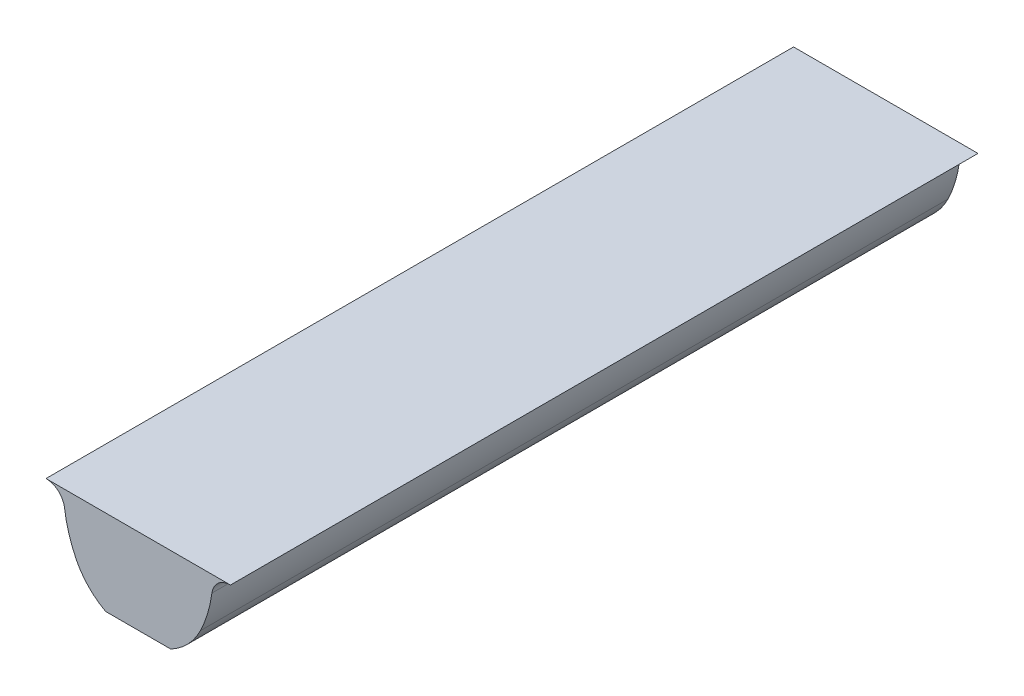
ISO-10303-21;
HEADER;
FILE_DESCRIPTION(('STEP AP214'),'2;1');
FILE_NAME('part.step','',(''),(''),'','','');
FILE_SCHEMA(('AUTOMOTIVE_DESIGN { 1 0 10303 214 1 1 1 1 }'));
ENDSEC;
DATA;
#1=APPLICATION_CONTEXT('core data for automotive mechanical design processes');
#2=APPLICATION_PROTOCOL_DEFINITION('international standard','automotive_design',2000,#1);
#3=PRODUCT_CONTEXT('',#1,'mechanical');
#4=PRODUCT('Part','Part','',(#3));
#5=PRODUCT_RELATED_PRODUCT_CATEGORY('part','',(#4));
#6=PRODUCT_DEFINITION_FORMATION('','',#4);
#7=PRODUCT_DEFINITION_CONTEXT('part definition',#1,'design');
#8=PRODUCT_DEFINITION('design','',#6,#7);
#9=PRODUCT_DEFINITION_SHAPE('','',#8);
#10=(LENGTH_UNIT() NAMED_UNIT(*) SI_UNIT(.MILLI.,.METRE.));
#11=(NAMED_UNIT(*) PLANE_ANGLE_UNIT() SI_UNIT($,.RADIAN.));
#12=(NAMED_UNIT(*) SI_UNIT($,.STERADIAN.) SOLID_ANGLE_UNIT());
#13=UNCERTAINTY_MEASURE_WITH_UNIT(LENGTH_MEASURE(1.E-05),#10,'distance_accuracy_value','');
#14=(GEOMETRIC_REPRESENTATION_CONTEXT(3) GLOBAL_UNCERTAINTY_ASSIGNED_CONTEXT((#13)) GLOBAL_UNIT_ASSIGNED_CONTEXT((#10,
#11,#12)) REPRESENTATION_CONTEXT('',''));
#15=CARTESIAN_POINT('',(0.,0.,0.));
#16=DIRECTION('',(0.,0.,1.));
#17=DIRECTION('',(1.,0.,0.));
#18=AXIS2_PLACEMENT_3D('',#15,#16,#17);
#19=CARTESIAN_POINT('',(-0.380490641846181,-0.15,6.));
#20=DIRECTION('',(0.,0.,-1.));
#21=DIRECTION('',(-1.,0.,0.));
#22=AXIS2_PLACEMENT_3D('',#19,#20,#21);
#23=CYLINDRICAL_SURFACE('',#22,0.15);
#24=CARTESIAN_POINT('',(-0.380490641846181,-0.15,0.));
#25=DIRECTION('',(0.,0.,1.));
#26=DIRECTION('',(1.,0.,0.));
#27=AXIS2_PLACEMENT_3D('',#24,#25,#26);
#28=CIRCLE('',#27,0.15);
#29=CARTESIAN_POINT('',(-0.231772108137597,-0.130434782608695,0.));
#30=VERTEX_POINT('',#29);
#31=CARTESIAN_POINT('',(-0.380490641846181,0.,0.));
#32=VERTEX_POINT('',#31);
#33=EDGE_CURVE('E135',#30,#32,#28,.T.);
#34=ORIENTED_EDGE('',*,*,#33,.F.);
#35=DIRECTION('',(0.,0.,-1.));
#36=VECTOR('',#35,1.);
#37=CARTESIAN_POINT('',(-0.231772108137597,-0.130434782608695,6.));
#38=LINE('',#37,#36);
#39=CARTESIAN_POINT('',(-0.231772108137597,-0.130434782608695,6.));
#40=VERTEX_POINT('',#39);
#41=EDGE_CURVE('E11',#40,#30,#38,.T.);
#42=ORIENTED_EDGE('',*,*,#41,.F.);
#43=CARTESIAN_POINT('',(-0.380490641846181,-0.15,6.));
#44=DIRECTION('',(0.,0.,1.));
#45=DIRECTION('',(1.,0.,0.));
#46=AXIS2_PLACEMENT_3D('',#43,#44,#45);
#47=CIRCLE('',#46,0.15);
#48=CARTESIAN_POINT('',(-0.380490641846181,0.,6.));
#49=VERTEX_POINT('',#48);
#50=EDGE_CURVE('E153',#40,#49,#47,.T.);
#51=ORIENTED_EDGE('',*,*,#50,.T.);
#52=DIRECTION('',(0.,0.,-1.));
#53=VECTOR('',#52,1.);
#54=CARTESIAN_POINT('',(-0.380490641846181,0.,6.));
#55=LINE('',#54,#53);
#56=EDGE_CURVE('E40',#49,#32,#55,.T.);
#57=ORIENTED_EDGE('',*,*,#56,.T.);
#58=EDGE_LOOP('',(#34,#42,#51,#57));
#59=FACE_BOUND('',#58,.T.);
#60=ADVANCED_FACE('F37',(#59),#23,.F.);
#61=CARTESIAN_POINT('',(0.759684783252957,0.,6.));
#62=DIRECTION('',(0.,0.,-1.));
#63=DIRECTION('',(-1.,0.,0.));
#64=AXIS2_PLACEMENT_3D('',#61,#62,#63);
#65=CYLINDRICAL_SURFACE('',#64,1.);
#66=CARTESIAN_POINT('',(0.759684783252957,0.,0.));
#67=DIRECTION('',(0.,0.,1.));
#68=DIRECTION('',(1.,0.,0.));
#69=AXIS2_PLACEMENT_3D('',#66,#67,#68);
#70=CIRCLE('',#69,1.);
#71=CARTESIAN_POINT('',(-0.139191621241425,-0.438202247191011,0.));
#72=VERTEX_POINT('',#71);
#73=EDGE_CURVE('E82',#30,#72,#70,.T.);
#74=ORIENTED_EDGE('',*,*,#73,.T.);
#75=DIRECTION('',(0.,0.,-1.));
#76=VECTOR('',#75,1.);
#77=CARTESIAN_POINT('',(-0.139191621241425,-0.438202247191011,6.));
#78=LINE('',#77,#76);
#79=CARTESIAN_POINT('',(-0.139191621241425,-0.438202247191011,6.));
#80=VERTEX_POINT('',#79);
#81=EDGE_CURVE('E46',#80,#72,#78,.T.);
#82=ORIENTED_EDGE('',*,*,#81,.F.);
#83=CARTESIAN_POINT('',(0.759684783252957,0.,6.));
#84=DIRECTION('',(0.,0.,1.));
#85=DIRECTION('',(1.,0.,0.));
#86=AXIS2_PLACEMENT_3D('',#83,#84,#85);
#87=CIRCLE('',#86,1.);
#88=EDGE_CURVE('E113',#40,#80,#87,.T.);
#89=ORIENTED_EDGE('',*,*,#88,.F.);
#90=ORIENTED_EDGE('',*,*,#41,.T.);
#91=EDGE_LOOP('',(#74,#82,#89,#90));
#92=FACE_BOUND('',#91,.T.);
#93=ADVANCED_FACE('F191',(#92),#65,.T.);
#94=CARTESIAN_POINT('',(0.359684783252957,-0.195,6.));
#95=DIRECTION('',(0.,0.,-1.));
#96=DIRECTION('',(-1.,0.,0.));
#97=AXIS2_PLACEMENT_3D('',#94,#95,#96);
#98=CYLINDRICAL_SURFACE('',#97,0.555);
#99=CARTESIAN_POINT('',(0.359684783252957,-0.195,0.));
#100=DIRECTION('',(0.,0.,1.));
#101=DIRECTION('',(1.,0.,0.));
#102=AXIS2_PLACEMENT_3D('',#99,#100,#101);
#103=CIRCLE('',#102,0.555);
#104=CARTESIAN_POINT('',(0.09871203133488,-0.68481447789577,0.));
#105=VERTEX_POINT('',#104);
#106=EDGE_CURVE('E120',#72,#105,#103,.T.);
#107=ORIENTED_EDGE('',*,*,#106,.T.);
#108=DIRECTION('',(0.,0.,-1.));
#109=VECTOR('',#108,1.);
#110=CARTESIAN_POINT('',(0.09871203133488,-0.68481447789577,6.));
#111=LINE('',#110,#109);
#112=CARTESIAN_POINT('',(0.09871203133488,-0.68481447789577,6.));
#113=VERTEX_POINT('',#112);
#114=EDGE_CURVE('E117',#113,#105,#111,.T.);
#115=ORIENTED_EDGE('',*,*,#114,.F.);
#116=CARTESIAN_POINT('',(0.359684783252957,-0.195,6.));
#117=DIRECTION('',(0.,0.,1.));
#118=DIRECTION('',(1.,0.,0.));
#119=AXIS2_PLACEMENT_3D('',#116,#117,#118);
#120=CIRCLE('',#119,0.555);
#121=EDGE_CURVE('E106',#80,#113,#120,.T.);
#122=ORIENTED_EDGE('',*,*,#121,.F.);
#123=ORIENTED_EDGE('',*,*,#81,.T.);
#124=EDGE_LOOP('',(#107,#115,#122,#123));
#125=FACE_BOUND('',#124,.T.);
#126=ADVANCED_FACE('F118',(#125),#98,.T.);
#127=CARTESIAN_POINT('',(0.09871203133488,-0.68481447789577,6.));
#128=DIRECTION('',(0.,1.,0.));
#129=DIRECTION('',(0.,0.,1.));
#130=AXIS2_PLACEMENT_3D('',#127,#128,#129);
#131=PLANE('',#130);
#132=DIRECTION('',(1.,0.,0.));
#133=VECTOR('',#132,1.);
#134=CARTESIAN_POINT('',(0.09871203133488,-0.68481447789577,0.));
#135=LINE('',#134,#133);
#136=CARTESIAN_POINT('',(0.620657535171034,-0.68481447789577,0.));
#137=VERTEX_POINT('',#136);
#138=EDGE_CURVE('E150',#105,#137,#135,.T.);
#139=ORIENTED_EDGE('',*,*,#138,.T.);
#140=DIRECTION('',(0.,0.,-1.));
#141=VECTOR('',#140,1.);
#142=CARTESIAN_POINT('',(0.620657535171034,-0.68481447789577,6.));
#143=LINE('',#142,#141);
#144=CARTESIAN_POINT('',(0.620657535171034,-0.68481447789577,6.));
#145=VERTEX_POINT('',#144);
#146=EDGE_CURVE('E123',#145,#137,#143,.T.);
#147=ORIENTED_EDGE('',*,*,#146,.F.);
#148=DIRECTION('',(1.,0.,0.));
#149=VECTOR('',#148,1.);
#150=CARTESIAN_POINT('',(0.09871203133488,-0.68481447789577,6.));
#151=LINE('',#150,#149);
#152=EDGE_CURVE('E111',#113,#145,#151,.T.);
#153=ORIENTED_EDGE('',*,*,#152,.F.);
#154=ORIENTED_EDGE('',*,*,#114,.T.);
#155=EDGE_LOOP('',(#139,#147,#153,#154));
#156=FACE_BOUND('',#155,.T.);
#157=ADVANCED_FACE('F125',(#156),#131,.F.);
#158=CARTESIAN_POINT('',(0.359684783252957,-0.195,6.));
#159=DIRECTION('',(0.,0.,-1.));
#160=DIRECTION('',(-1.,0.,0.));
#161=AXIS2_PLACEMENT_3D('',#158,#159,#160);
#162=CYLINDRICAL_SURFACE('',#161,0.555);
#163=CARTESIAN_POINT('',(0.359684783252957,-0.195,0.));
#164=DIRECTION('',(0.,0.,1.));
#165=DIRECTION('',(1.,0.,0.));
#166=AXIS2_PLACEMENT_3D('',#163,#164,#165);
#167=CIRCLE('',#166,0.555);
#168=CARTESIAN_POINT('',(0.858561187747339,-0.438202247191011,0.));
#169=VERTEX_POINT('',#168);
#170=EDGE_CURVE('E147',#137,#169,#167,.T.);
#171=ORIENTED_EDGE('',*,*,#170,.T.);
#172=DIRECTION('',(0.,0.,-1.));
#173=VECTOR('',#172,1.);
#174=CARTESIAN_POINT('',(0.858561187747339,-0.438202247191011,6.));
#175=LINE('',#174,#173);
#176=CARTESIAN_POINT('',(0.858561187747339,-0.438202247191011,6.));
#177=VERTEX_POINT('',#176);
#178=EDGE_CURVE('E157',#177,#169,#175,.T.);
#179=ORIENTED_EDGE('',*,*,#178,.F.);
#180=CARTESIAN_POINT('',(0.359684783252957,-0.195,6.));
#181=DIRECTION('',(0.,0.,1.));
#182=DIRECTION('',(1.,0.,0.));
#183=AXIS2_PLACEMENT_3D('',#180,#181,#182);
#184=CIRCLE('',#183,0.555);
#185=EDGE_CURVE('E128',#145,#177,#184,.T.);
#186=ORIENTED_EDGE('',*,*,#185,.F.);
#187=ORIENTED_EDGE('',*,*,#146,.T.);
#188=EDGE_LOOP('',(#171,#179,#186,#187));
#189=FACE_BOUND('',#188,.T.);
#190=ADVANCED_FACE('F168',(#189),#162,.T.);
#191=CARTESIAN_POINT('',(-0.0403152167470431,0.,6.));
#192=DIRECTION('',(0.,0.,-1.));
#193=DIRECTION('',(-1.,0.,0.));
#194=AXIS2_PLACEMENT_3D('',#191,#192,#193);
#195=CYLINDRICAL_SURFACE('',#194,1.);
#196=CARTESIAN_POINT('',(-0.0403152167470431,0.,0.));
#197=DIRECTION('',(0.,0.,-1.));
#198=DIRECTION('',(-1.,0.,0.));
#199=AXIS2_PLACEMENT_3D('',#196,#197,#198);
#200=CIRCLE('',#199,1.);
#201=CARTESIAN_POINT('',(0.951141674643512,-0.130434782608695,0.));
#202=VERTEX_POINT('',#201);
#203=EDGE_CURVE('E144',#202,#169,#200,.T.);
#204=ORIENTED_EDGE('',*,*,#203,.F.);
#205=DIRECTION('',(0.,0.,-1.));
#206=VECTOR('',#205,1.);
#207=CARTESIAN_POINT('',(0.951141674643512,-0.130434782608695,6.));
#208=LINE('',#207,#206);
#209=CARTESIAN_POINT('',(0.951141674643512,-0.130434782608695,6.));
#210=VERTEX_POINT('',#209);
#211=EDGE_CURVE('E159',#210,#202,#208,.T.);
#212=ORIENTED_EDGE('',*,*,#211,.F.);
#213=CARTESIAN_POINT('',(-0.0403152167470431,0.,6.));
#214=DIRECTION('',(0.,0.,-1.));
#215=DIRECTION('',(-1.,0.,0.));
#216=AXIS2_PLACEMENT_3D('',#213,#214,#215);
#217=CIRCLE('',#216,1.);
#218=EDGE_CURVE('E130',#210,#177,#217,.T.);
#219=ORIENTED_EDGE('',*,*,#218,.T.);
#220=ORIENTED_EDGE('',*,*,#178,.T.);
#221=EDGE_LOOP('',(#204,#212,#219,#220));
#222=FACE_BOUND('',#221,.T.);
#223=ADVANCED_FACE('F180',(#222),#195,.T.);
#224=CARTESIAN_POINT('',(1.09986020835209,-0.15,6.));
#225=DIRECTION('',(0.,0.,-1.));
#226=DIRECTION('',(-1.,0.,0.));
#227=AXIS2_PLACEMENT_3D('',#224,#225,#226);
#228=CYLINDRICAL_SURFACE('',#227,0.15);
#229=CARTESIAN_POINT('',(1.09986020835209,-0.15,0.));
#230=DIRECTION('',(0.,0.,-1.));
#231=DIRECTION('',(-1.,0.,0.));
#232=AXIS2_PLACEMENT_3D('',#229,#230,#231);
#233=CIRCLE('',#232,0.15);
#234=CARTESIAN_POINT('',(1.09986020835209,0.,0.));
#235=VERTEX_POINT('',#234);
#236=EDGE_CURVE('E141',#202,#235,#233,.T.);
#237=ORIENTED_EDGE('',*,*,#236,.T.);
#238=DIRECTION('',(0.,0.,-1.));
#239=VECTOR('',#238,1.);
#240=CARTESIAN_POINT('',(1.09986020835209,0.,6.));
#241=LINE('',#240,#239);
#242=CARTESIAN_POINT('',(1.09986020835209,0.,6.));
#243=VERTEX_POINT('',#242);
#244=EDGE_CURVE('E160',#243,#235,#241,.T.);
#245=ORIENTED_EDGE('',*,*,#244,.F.);
#246=CARTESIAN_POINT('',(1.09986020835209,-0.15,6.));
#247=DIRECTION('',(0.,0.,-1.));
#248=DIRECTION('',(-1.,0.,0.));
#249=AXIS2_PLACEMENT_3D('',#246,#247,#248);
#250=CIRCLE('',#249,0.15);
#251=EDGE_CURVE('E173',#210,#243,#250,.T.);
#252=ORIENTED_EDGE('',*,*,#251,.F.);
#253=ORIENTED_EDGE('',*,*,#211,.T.);
#254=EDGE_LOOP('',(#237,#245,#252,#253));
#255=FACE_BOUND('',#254,.T.);
#256=ADVANCED_FACE('F182',(#255),#228,.F.);
#257=CARTESIAN_POINT('',(-0.380490641846181,0.,6.));
#258=DIRECTION('',(0.,1.,0.));
#259=DIRECTION('',(-1.,0.,0.));
#260=AXIS2_PLACEMENT_3D('',#257,#258,#259);
#261=PLANE('',#260);
#262=DIRECTION('',(1.,0.,0.));
#263=VECTOR('',#262,1.);
#264=CARTESIAN_POINT('',(-0.380490641846181,0.,0.));
#265=LINE('',#264,#263);
#266=EDGE_CURVE('E138',#32,#235,#265,.T.);
#267=ORIENTED_EDGE('',*,*,#266,.F.);
#268=ORIENTED_EDGE('',*,*,#56,.F.);
#269=DIRECTION('',(1.,0.,0.));
#270=VECTOR('',#269,1.);
#271=CARTESIAN_POINT('',(-0.380490641846181,0.,6.));
#272=LINE('',#271,#270);
#273=EDGE_CURVE('E175',#49,#243,#272,.T.);
#274=ORIENTED_EDGE('',*,*,#273,.T.);
#275=ORIENTED_EDGE('',*,*,#244,.T.);
#276=EDGE_LOOP('',(#267,#268,#274,#275));
#277=FACE_BOUND('',#276,.T.);
#278=ADVANCED_FACE('F162',(#277),#261,.T.);
#279=CARTESIAN_POINT('',(-0.380490641846181,-0.15,6.));
#280=DIRECTION('',(0.,0.,1.));
#281=DIRECTION('',(1.,0.,0.));
#282=AXIS2_PLACEMENT_3D('',#279,#280,#281);
#283=PLANE('',#282);
#284=ORIENTED_EDGE('',*,*,#50,.F.);
#285=ORIENTED_EDGE('',*,*,#88,.T.);
#286=ORIENTED_EDGE('',*,*,#121,.T.);
#287=ORIENTED_EDGE('',*,*,#152,.T.);
#288=ORIENTED_EDGE('',*,*,#185,.T.);
#289=ORIENTED_EDGE('',*,*,#218,.F.);
#290=ORIENTED_EDGE('',*,*,#251,.T.);
#291=ORIENTED_EDGE('',*,*,#273,.F.);
#292=EDGE_LOOP('',(#284,#285,#286,#287,#288,#289,#290,#291));
#293=FACE_BOUND('',#292,.T.);
#294=ADVANCED_FACE('F109',(#293),#283,.T.);
#295=CARTESIAN_POINT('',(-0.380490641846181,-0.15,0.));
#296=DIRECTION('',(0.,0.,1.));
#297=DIRECTION('',(1.,0.,0.));
#298=AXIS2_PLACEMENT_3D('',#295,#296,#297);
#299=PLANE('',#298);
#300=ORIENTED_EDGE('',*,*,#33,.T.);
#301=ORIENTED_EDGE('',*,*,#266,.T.);
#302=ORIENTED_EDGE('',*,*,#236,.F.);
#303=ORIENTED_EDGE('',*,*,#203,.T.);
#304=ORIENTED_EDGE('',*,*,#170,.F.);
#305=ORIENTED_EDGE('',*,*,#138,.F.);
#306=ORIENTED_EDGE('',*,*,#106,.F.);
#307=ORIENTED_EDGE('',*,*,#73,.F.);
#308=EDGE_LOOP('',(#300,#301,#302,#303,#304,#305,#306,#307));
#309=FACE_BOUND('',#308,.T.);
#310=ADVANCED_FACE('F165',(#309),#299,.F.);
#311=CLOSED_SHELL('',(#60,#93,#126,#157,#190,#223,#256,#278,#294,#310));
#312=MANIFOLD_SOLID_BREP('B2',#311);
#313=ADVANCED_BREP_SHAPE_REPRESENTATION('',(#18,#312),#14);
#314=SHAPE_DEFINITION_REPRESENTATION(#9,#313);
ENDSEC;
END-ISO-10303-21;
